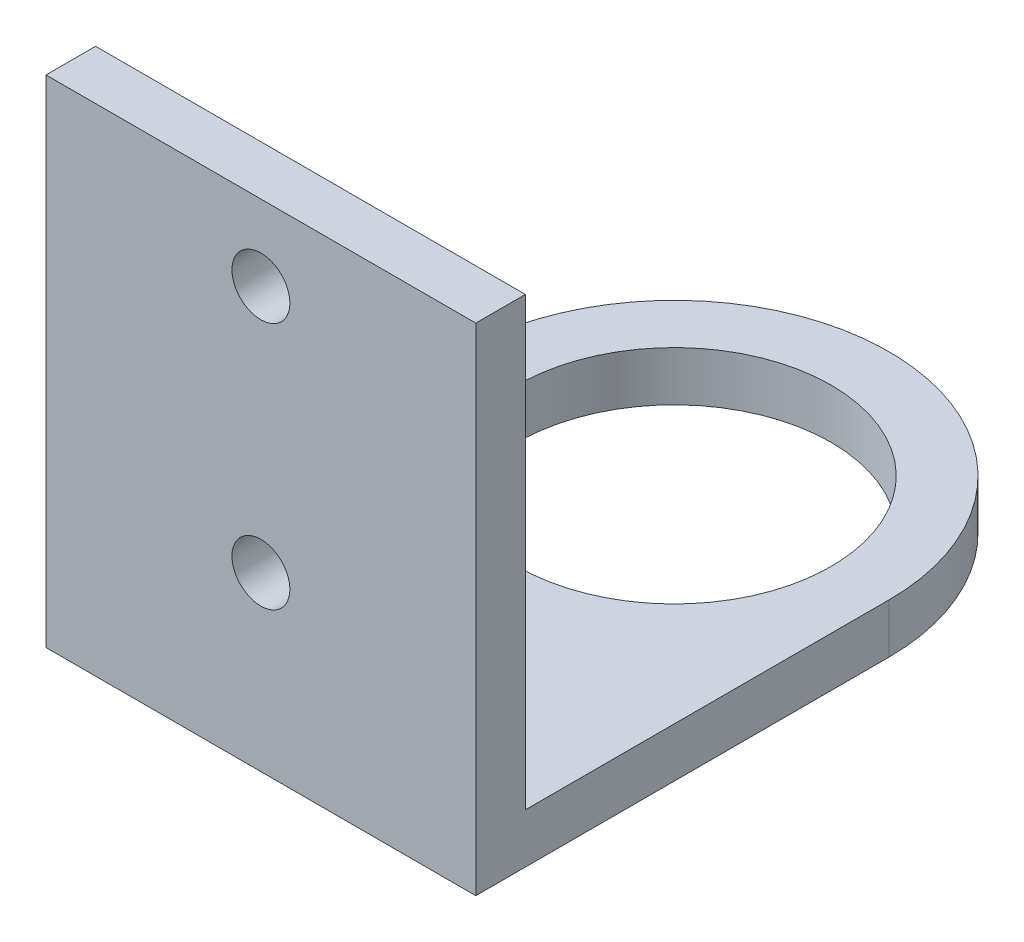
ISO-10303-21;
HEADER;
FILE_DESCRIPTION(('STEP AP214'),'2;1');
FILE_NAME('part.step','',(''),(''),'','','');
FILE_SCHEMA(('AUTOMOTIVE_DESIGN { 1 0 10303 214 1 1 1 1 }'));
ENDSEC;
DATA;
#1=APPLICATION_CONTEXT('core data for automotive mechanical design processes');
#2=APPLICATION_PROTOCOL_DEFINITION('international standard','automotive_design',2000,#1);
#3=PRODUCT_CONTEXT('',#1,'mechanical');
#4=PRODUCT('Part','Part','',(#3));
#5=PRODUCT_RELATED_PRODUCT_CATEGORY('part','',(#4));
#6=PRODUCT_DEFINITION_FORMATION('','',#4);
#7=PRODUCT_DEFINITION_CONTEXT('part definition',#1,'design');
#8=PRODUCT_DEFINITION('design','',#6,#7);
#9=PRODUCT_DEFINITION_SHAPE('','',#8);
#10=(LENGTH_UNIT() NAMED_UNIT(*) SI_UNIT(.MILLI.,.METRE.));
#11=(NAMED_UNIT(*) PLANE_ANGLE_UNIT() SI_UNIT($,.RADIAN.));
#12=(NAMED_UNIT(*) SI_UNIT($,.STERADIAN.) SOLID_ANGLE_UNIT());
#13=UNCERTAINTY_MEASURE_WITH_UNIT(LENGTH_MEASURE(1.E-05),#10,'distance_accuracy_value','');
#14=(GEOMETRIC_REPRESENTATION_CONTEXT(3) GLOBAL_UNCERTAINTY_ASSIGNED_CONTEXT((#13)) GLOBAL_UNIT_ASSIGNED_CONTEXT((#10,
#11,#12)) REPRESENTATION_CONTEXT('',''));
#15=CARTESIAN_POINT('',(0.,0.,0.));
#16=DIRECTION('',(0.,0.,1.));
#17=DIRECTION('',(1.,0.,0.));
#18=AXIS2_PLACEMENT_3D('',#15,#16,#17);
#19=CARTESIAN_POINT('',(0.,3.,0.));
#20=DIRECTION('',(0.,-1.,0.));
#21=DIRECTION('',(0.,0.,-1.));
#22=AXIS2_PLACEMENT_3D('',#19,#20,#21);
#23=CYLINDRICAL_SURFACE('',#22,13.);
#24=CARTESIAN_POINT('',(0.,0.,0.));
#25=DIRECTION('',(0.,1.,0.));
#26=DIRECTION('',(0.,0.,1.));
#27=AXIS2_PLACEMENT_3D('',#24,#25,#26);
#28=CIRCLE('',#27,13.);
#29=CARTESIAN_POINT('',(13.,0.,0.));
#30=VERTEX_POINT('',#29);
#31=CARTESIAN_POINT('',(-13.,0.,0.));
#32=VERTEX_POINT('',#31);
#33=EDGE_CURVE('E132',#30,#32,#28,.T.);
#34=ORIENTED_EDGE('',*,*,#33,.T.);
#35=DIRECTION('',(0.,-1.,0.));
#36=VECTOR('',#35,1.);
#37=CARTESIAN_POINT('',(-13.,3.,0.));
#38=LINE('',#37,#36);
#39=CARTESIAN_POINT('',(-13.,3.,0.));
#40=VERTEX_POINT('',#39);
#41=EDGE_CURVE('E11',#40,#32,#38,.T.);
#42=ORIENTED_EDGE('',*,*,#41,.F.);
#43=CARTESIAN_POINT('',(0.,3.,0.));
#44=DIRECTION('',(0.,1.,0.));
#45=DIRECTION('',(0.,0.,1.));
#46=AXIS2_PLACEMENT_3D('',#43,#44,#45);
#47=CIRCLE('',#46,13.);
#48=CARTESIAN_POINT('',(13.,3.,0.));
#49=VERTEX_POINT('',#48);
#50=EDGE_CURVE('E124',#49,#40,#47,.T.);
#51=ORIENTED_EDGE('',*,*,#50,.F.);
#52=DIRECTION('',(0.,-1.,0.));
#53=VECTOR('',#52,1.);
#54=CARTESIAN_POINT('',(13.,3.,0.));
#55=LINE('',#54,#53);
#56=EDGE_CURVE('E129',#49,#30,#55,.T.);
#57=ORIENTED_EDGE('',*,*,#56,.T.);
#58=EDGE_LOOP('',(#34,#42,#51,#57));
#59=FACE_BOUND('',#58,.T.);
#60=ADVANCED_FACE('F37',(#59),#23,.T.);
#61=CARTESIAN_POINT('',(-13.,3.,0.));
#62=DIRECTION('',(1.,0.,0.));
#63=DIRECTION('',(0.,0.,-1.));
#64=AXIS2_PLACEMENT_3D('',#61,#62,#63);
#65=PLANE('',#64);
#66=DIRECTION('',(0.,0.,1.));
#67=VECTOR('',#66,1.);
#68=CARTESIAN_POINT('',(-13.,0.,0.));
#69=LINE('',#68,#67);
#70=CARTESIAN_POINT('',(-13.,0.,25.));
#71=VERTEX_POINT('',#70);
#72=EDGE_CURVE('E135',#32,#71,#69,.T.);
#73=ORIENTED_EDGE('',*,*,#72,.T.);
#74=DIRECTION('',(0.,-1.,0.));
#75=VECTOR('',#74,1.);
#76=CARTESIAN_POINT('',(-13.,3.,25.));
#77=LINE('',#76,#75);
#78=CARTESIAN_POINT('',(-13.,30.,25.));
#79=VERTEX_POINT('',#78);
#80=EDGE_CURVE('E45',#79,#71,#77,.T.);
#81=ORIENTED_EDGE('',*,*,#80,.F.);
#82=DIRECTION('',(0.,0.,1.));
#83=VECTOR('',#82,1.);
#84=CARTESIAN_POINT('',(-13.,30.,22.));
#85=LINE('',#84,#83);
#86=CARTESIAN_POINT('',(-13.,30.,22.));
#87=VERTEX_POINT('',#86);
#88=EDGE_CURVE('E107',#87,#79,#85,.T.);
#89=ORIENTED_EDGE('',*,*,#88,.F.);
#90=DIRECTION('',(0.,-1.,0.));
#91=VECTOR('',#90,1.);
#92=CARTESIAN_POINT('',(-13.,0.,22.));
#93=LINE('',#92,#91);
#94=CARTESIAN_POINT('',(-13.,3.,22.));
#95=VERTEX_POINT('',#94);
#96=EDGE_CURVE('E108',#87,#95,#93,.T.);
#97=ORIENTED_EDGE('',*,*,#96,.T.);
#98=DIRECTION('',(0.,0.,1.));
#99=VECTOR('',#98,1.);
#100=CARTESIAN_POINT('',(-13.,3.,0.));
#101=LINE('',#100,#99);
#102=EDGE_CURVE('E57',#40,#95,#101,.T.);
#103=ORIENTED_EDGE('',*,*,#102,.F.);
#104=ORIENTED_EDGE('',*,*,#41,.T.);
#105=EDGE_LOOP('',(#73,#81,#89,#97,#103,#104));
#106=FACE_BOUND('',#105,.T.);
#107=ADVANCED_FACE('F173',(#106),#65,.F.);
#108=CARTESIAN_POINT('',(0.,3.,25.));
#109=DIRECTION('',(0.,0.,-1.));
#110=DIRECTION('',(-1.,0.,0.));
#111=AXIS2_PLACEMENT_3D('',#108,#109,#110);
#112=PLANE('',#111);
#113=CARTESIAN_POINT('',(0.,10.4220836531699,25.));
#114=DIRECTION('',(0.,0.,-1.));
#115=DIRECTION('',(-1.,0.,0.));
#116=AXIS2_PLACEMENT_3D('',#113,#114,#115);
#117=CIRCLE('',#116,1.75);
#118=CARTESIAN_POINT('',(-1.75,10.4220836531699,25.));
#119=VERTEX_POINT('',#118);
#120=EDGE_CURVE('E117',#119,#119,#117,.T.);
#121=ORIENTED_EDGE('',*,*,#120,.T.);
#122=EDGE_LOOP('',(#121));
#123=FACE_BOUND('',#122,.T.);
#124=CARTESIAN_POINT('',(0.,25.4220836531699,25.));
#125=DIRECTION('',(0.,0.,-1.));
#126=DIRECTION('',(-1.,0.,0.));
#127=AXIS2_PLACEMENT_3D('',#124,#125,#126);
#128=CIRCLE('',#127,1.75);
#129=CARTESIAN_POINT('',(-1.75,25.4220836531699,25.));
#130=VERTEX_POINT('',#129);
#131=EDGE_CURVE('E250',#130,#130,#128,.T.);
#132=ORIENTED_EDGE('',*,*,#131,.T.);
#133=EDGE_LOOP('',(#132));
#134=FACE_BOUND('',#133,.T.);
#135=DIRECTION('',(1.,0.,0.));
#136=VECTOR('',#135,1.);
#137=CARTESIAN_POINT('',(0.,0.,25.));
#138=LINE('',#137,#136);
#139=CARTESIAN_POINT('',(13.,0.,25.));
#140=VERTEX_POINT('',#139);
#141=EDGE_CURVE('E137',#71,#140,#138,.T.);
#142=ORIENTED_EDGE('',*,*,#141,.T.);
#143=DIRECTION('',(0.,-1.,0.));
#144=VECTOR('',#143,1.);
#145=CARTESIAN_POINT('',(13.,3.,25.));
#146=LINE('',#145,#144);
#147=CARTESIAN_POINT('',(13.,30.,25.));
#148=VERTEX_POINT('',#147);
#149=EDGE_CURVE('E142',#148,#140,#146,.T.);
#150=ORIENTED_EDGE('',*,*,#149,.F.);
#151=DIRECTION('',(-1.,0.,0.));
#152=VECTOR('',#151,1.);
#153=CARTESIAN_POINT('',(-13.,30.,25.));
#154=LINE('',#153,#152);
#155=EDGE_CURVE('E99',#148,#79,#154,.T.);
#156=ORIENTED_EDGE('',*,*,#155,.T.);
#157=ORIENTED_EDGE('',*,*,#80,.T.);
#158=EDGE_LOOP('',(#142,#150,#156,#157));
#159=FACE_BOUND('',#158,.T.);
#160=ADVANCED_FACE('F146',(#123,#134,#159),#112,.F.);
#161=CARTESIAN_POINT('',(0.,3.,0.));
#162=DIRECTION('',(0.,-1.,0.));
#163=DIRECTION('',(0.,0.,-1.));
#164=AXIS2_PLACEMENT_3D('',#161,#162,#163);
#165=CYLINDRICAL_SURFACE('',#164,9.5);
#166=CARTESIAN_POINT('',(0.,3.,0.));
#167=DIRECTION('',(0.,1.,0.));
#168=DIRECTION('',(0.,0.,1.));
#169=AXIS2_PLACEMENT_3D('',#166,#167,#168);
#170=CIRCLE('',#169,9.5);
#171=CARTESIAN_POINT('',(0.,3.,9.5));
#172=VERTEX_POINT('',#171);
#173=EDGE_CURVE('E121',#172,#172,#170,.T.);
#174=ORIENTED_EDGE('',*,*,#173,.T.);
#175=EDGE_LOOP('',(#174));
#176=FACE_BOUND('',#175,.T.);
#177=CARTESIAN_POINT('',(0.,0.,0.));
#178=DIRECTION('',(0.,1.,0.));
#179=DIRECTION('',(0.,0.,1.));
#180=AXIS2_PLACEMENT_3D('',#177,#178,#179);
#181=CIRCLE('',#180,9.5);
#182=CARTESIAN_POINT('',(0.,0.,9.5));
#183=VERTEX_POINT('',#182);
#184=EDGE_CURVE('E120',#183,#183,#181,.T.);
#185=ORIENTED_EDGE('',*,*,#184,.F.);
#186=EDGE_LOOP('',(#185));
#187=FACE_BOUND('',#186,.T.);
#188=ADVANCED_FACE('F39',(#176,#187),#165,.F.);
#189=CARTESIAN_POINT('',(13.,3.,0.));
#190=DIRECTION('',(-1.,0.,0.));
#191=DIRECTION('',(0.,0.,1.));
#192=AXIS2_PLACEMENT_3D('',#189,#190,#191);
#193=PLANE('',#192);
#194=DIRECTION('',(0.,0.,-1.));
#195=VECTOR('',#194,1.);
#196=CARTESIAN_POINT('',(13.,3.,0.));
#197=LINE('',#196,#195);
#198=CARTESIAN_POINT('',(13.,3.,22.));
#199=VERTEX_POINT('',#198);
#200=EDGE_CURVE('E95',#199,#49,#197,.T.);
#201=ORIENTED_EDGE('',*,*,#200,.F.);
#202=DIRECTION('',(0.,1.,0.));
#203=VECTOR('',#202,1.);
#204=CARTESIAN_POINT('',(13.,30.,22.));
#205=LINE('',#204,#203);
#206=CARTESIAN_POINT('',(13.,30.,22.));
#207=VERTEX_POINT('',#206);
#208=EDGE_CURVE('E88',#199,#207,#205,.T.);
#209=ORIENTED_EDGE('',*,*,#208,.T.);
#210=DIRECTION('',(0.,0.,1.));
#211=VECTOR('',#210,1.);
#212=CARTESIAN_POINT('',(13.,30.,22.));
#213=LINE('',#212,#211);
#214=EDGE_CURVE('E92',#207,#148,#213,.T.);
#215=ORIENTED_EDGE('',*,*,#214,.T.);
#216=ORIENTED_EDGE('',*,*,#149,.T.);
#217=DIRECTION('',(0.,0.,-1.));
#218=VECTOR('',#217,1.);
#219=CARTESIAN_POINT('',(13.,0.,0.));
#220=LINE('',#219,#218);
#221=EDGE_CURVE('E125',#140,#30,#220,.T.);
#222=ORIENTED_EDGE('',*,*,#221,.T.);
#223=ORIENTED_EDGE('',*,*,#56,.F.);
#224=EDGE_LOOP('',(#201,#209,#215,#216,#222,#223));
#225=FACE_BOUND('',#224,.T.);
#226=ADVANCED_FACE('F90',(#225),#193,.F.);
#227=CARTESIAN_POINT('',(0.,3.,0.));
#228=DIRECTION('',(0.,1.,0.));
#229=DIRECTION('',(0.,0.,1.));
#230=AXIS2_PLACEMENT_3D('',#227,#228,#229);
#231=PLANE('',#230);
#232=DIRECTION('',(-1.,0.,0.));
#233=VECTOR('',#232,1.);
#234=CARTESIAN_POINT('',(0.,3.,22.));
#235=LINE('',#234,#233);
#236=EDGE_CURVE('E52',#199,#95,#235,.T.);
#237=ORIENTED_EDGE('',*,*,#236,.F.);
#238=ORIENTED_EDGE('',*,*,#200,.T.);
#239=ORIENTED_EDGE('',*,*,#50,.T.);
#240=ORIENTED_EDGE('',*,*,#102,.T.);
#241=EDGE_LOOP('',(#237,#238,#239,#240));
#242=FACE_BOUND('',#241,.T.);
#243=ORIENTED_EDGE('',*,*,#173,.F.);
#244=EDGE_LOOP('',(#243));
#245=FACE_BOUND('',#244,.T.);
#246=ADVANCED_FACE('F155',(#242,#245),#231,.T.);
#247=CARTESIAN_POINT('',(0.,0.,0.));
#248=DIRECTION('',(0.,1.,0.));
#249=DIRECTION('',(0.,0.,1.));
#250=AXIS2_PLACEMENT_3D('',#247,#248,#249);
#251=PLANE('',#250);
#252=ORIENTED_EDGE('',*,*,#184,.T.);
#253=EDGE_LOOP('',(#252));
#254=FACE_BOUND('',#253,.T.);
#255=ORIENTED_EDGE('',*,*,#33,.F.);
#256=ORIENTED_EDGE('',*,*,#221,.F.);
#257=ORIENTED_EDGE('',*,*,#141,.F.);
#258=ORIENTED_EDGE('',*,*,#72,.F.);
#259=EDGE_LOOP('',(#255,#256,#257,#258));
#260=FACE_BOUND('',#259,.T.);
#261=ADVANCED_FACE('F151',(#254,#260),#251,.F.);
#262=CARTESIAN_POINT('',(-13.,30.,22.));
#263=DIRECTION('',(0.,1.,0.));
#264=DIRECTION('',(0.,0.,1.));
#265=AXIS2_PLACEMENT_3D('',#262,#263,#264);
#266=PLANE('',#265);
#267=ORIENTED_EDGE('',*,*,#155,.F.);
#268=ORIENTED_EDGE('',*,*,#214,.F.);
#269=DIRECTION('',(-1.,0.,0.));
#270=VECTOR('',#269,1.);
#271=CARTESIAN_POINT('',(-13.,30.,22.));
#272=LINE('',#271,#270);
#273=EDGE_CURVE('E98',#207,#87,#272,.T.);
#274=ORIENTED_EDGE('',*,*,#273,.T.);
#275=ORIENTED_EDGE('',*,*,#88,.T.);
#276=EDGE_LOOP('',(#267,#268,#274,#275));
#277=FACE_BOUND('',#276,.T.);
#278=ADVANCED_FACE('F103',(#277),#266,.T.);
#279=CARTESIAN_POINT('',(0.,0.,22.));
#280=DIRECTION('',(0.,0.,-1.));
#281=DIRECTION('',(-1.,0.,0.));
#282=AXIS2_PLACEMENT_3D('',#279,#280,#281);
#283=PLANE('',#282);
#284=CARTESIAN_POINT('',(0.,10.4220836531699,22.));
#285=DIRECTION('',(0.,0.,-1.));
#286=DIRECTION('',(-1.,0.,0.));
#287=AXIS2_PLACEMENT_3D('',#284,#285,#286);
#288=CIRCLE('',#287,1.75);
#289=CARTESIAN_POINT('',(-1.75,10.4220836531699,22.));
#290=VERTEX_POINT('',#289);
#291=EDGE_CURVE('E249',#290,#290,#288,.T.);
#292=ORIENTED_EDGE('',*,*,#291,.F.);
#293=EDGE_LOOP('',(#292));
#294=FACE_BOUND('',#293,.T.);
#295=CARTESIAN_POINT('',(0.,25.4220836531699,22.));
#296=DIRECTION('',(0.,0.,-1.));
#297=DIRECTION('',(-1.,0.,0.));
#298=AXIS2_PLACEMENT_3D('',#295,#296,#297);
#299=CIRCLE('',#298,1.75);
#300=CARTESIAN_POINT('',(-1.75,25.4220836531699,22.));
#301=VERTEX_POINT('',#300);
#302=EDGE_CURVE('E254',#301,#301,#299,.T.);
#303=ORIENTED_EDGE('',*,*,#302,.F.);
#304=EDGE_LOOP('',(#303));
#305=FACE_BOUND('',#304,.T.);
#306=ORIENTED_EDGE('',*,*,#208,.F.);
#307=ORIENTED_EDGE('',*,*,#236,.T.);
#308=ORIENTED_EDGE('',*,*,#96,.F.);
#309=ORIENTED_EDGE('',*,*,#273,.F.);
#310=EDGE_LOOP('',(#306,#307,#308,#309));
#311=FACE_BOUND('',#310,.T.);
#312=ADVANCED_FACE('F110',(#294,#305,#311),#283,.T.);
#313=CARTESIAN_POINT('',(0.,25.4220836531699,25.));
#314=DIRECTION('',(0.,0.,-1.));
#315=DIRECTION('',(-1.,0.,0.));
#316=AXIS2_PLACEMENT_3D('',#313,#314,#315);
#317=CYLINDRICAL_SURFACE('',#316,1.75);
#318=ORIENTED_EDGE('',*,*,#131,.F.);
#319=EDGE_LOOP('',(#318));
#320=FACE_BOUND('',#319,.T.);
#321=ORIENTED_EDGE('',*,*,#302,.T.);
#322=EDGE_LOOP('',(#321));
#323=FACE_BOUND('',#322,.T.);
#324=ADVANCED_FACE('F220',(#320,#323),#317,.F.);
#325=CARTESIAN_POINT('',(0.,10.4220836531699,25.));
#326=DIRECTION('',(0.,0.,-1.));
#327=DIRECTION('',(-1.,0.,0.));
#328=AXIS2_PLACEMENT_3D('',#325,#326,#327);
#329=CYLINDRICAL_SURFACE('',#328,1.75);
#330=ORIENTED_EDGE('',*,*,#120,.F.);
#331=EDGE_LOOP('',(#330));
#332=FACE_BOUND('',#331,.T.);
#333=ORIENTED_EDGE('',*,*,#291,.T.);
#334=EDGE_LOOP('',(#333));
#335=FACE_BOUND('',#334,.T.);
#336=ADVANCED_FACE('F230',(#332,#335),#329,.F.);
#337=CLOSED_SHELL('',(#60,#107,#160,#188,#226,#246,#261,#278,#312,#324,#336));
#338=MANIFOLD_SOLID_BREP('B2',#337);
#339=ADVANCED_BREP_SHAPE_REPRESENTATION('',(#18,#338),#14);
#340=SHAPE_DEFINITION_REPRESENTATION(#9,#339);
ENDSEC;
END-ISO-10303-21;
